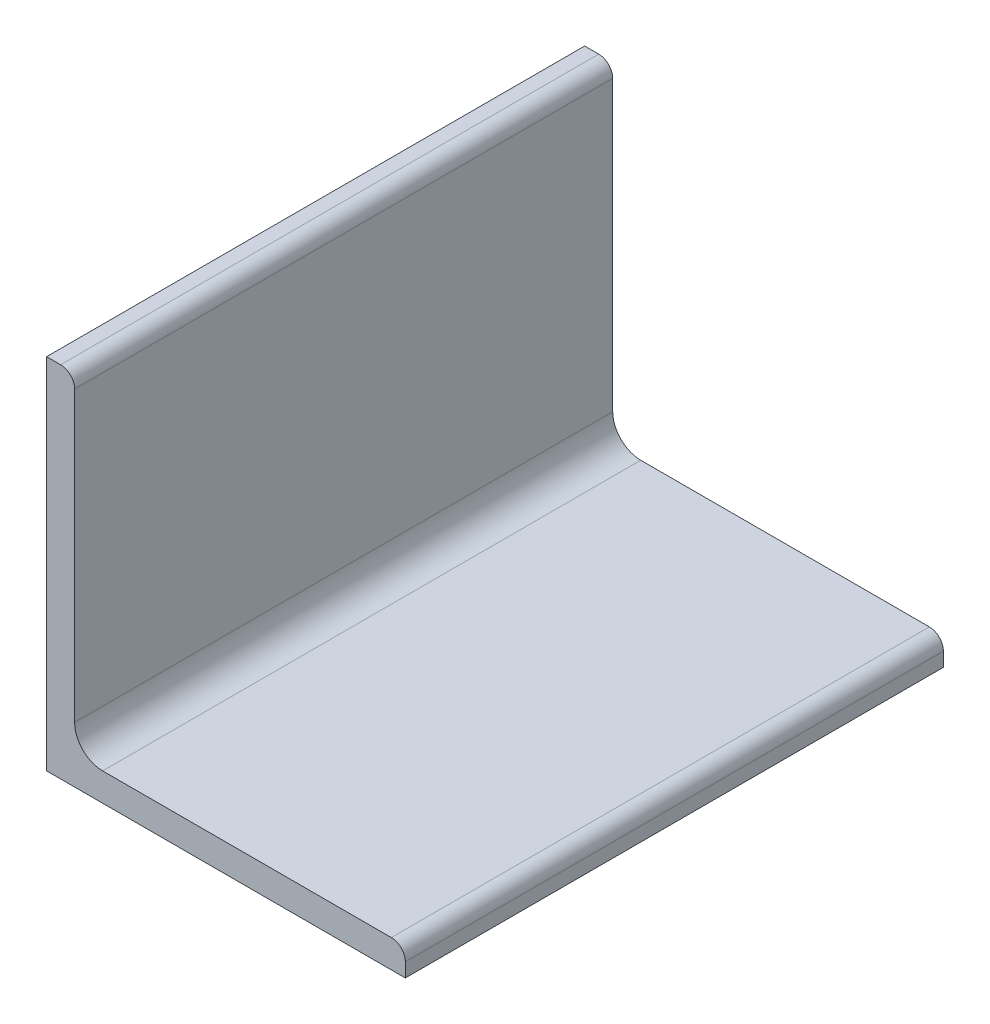
ISO-10303-21;
HEADER;
FILE_DESCRIPTION(('STEP AP214'),'2;1');
FILE_NAME('part.step','',(''),(''),'','','');
FILE_SCHEMA(('AUTOMOTIVE_DESIGN { 1 0 10303 214 1 1 1 1 }'));
ENDSEC;
DATA;
#1=APPLICATION_CONTEXT('core data for automotive mechanical design processes');
#2=APPLICATION_PROTOCOL_DEFINITION('international standard','automotive_design',2000,#1);
#3=PRODUCT_CONTEXT('',#1,'mechanical');
#4=PRODUCT('Part','Part','',(#3));
#5=PRODUCT_RELATED_PRODUCT_CATEGORY('part','',(#4));
#6=PRODUCT_DEFINITION_FORMATION('','',#4);
#7=PRODUCT_DEFINITION_CONTEXT('part definition',#1,'design');
#8=PRODUCT_DEFINITION('design','',#6,#7);
#9=PRODUCT_DEFINITION_SHAPE('','',#8);
#10=(LENGTH_UNIT() NAMED_UNIT(*) SI_UNIT(.MILLI.,.METRE.));
#11=(NAMED_UNIT(*) PLANE_ANGLE_UNIT() SI_UNIT($,.RADIAN.));
#12=(NAMED_UNIT(*) SI_UNIT($,.STERADIAN.) SOLID_ANGLE_UNIT());
#13=UNCERTAINTY_MEASURE_WITH_UNIT(LENGTH_MEASURE(1.E-05),#10,'distance_accuracy_value','');
#14=(GEOMETRIC_REPRESENTATION_CONTEXT(3) GLOBAL_UNCERTAINTY_ASSIGNED_CONTEXT((#13)) GLOBAL_UNIT_ASSIGNED_CONTEXT((#10,
#11,#12)) REPRESENTATION_CONTEXT('',''));
#15=CARTESIAN_POINT('',(0.,0.,0.));
#16=DIRECTION('',(0.,0.,1.));
#17=DIRECTION('',(1.,0.,0.));
#18=AXIS2_PLACEMENT_3D('',#15,#16,#17);
#19=CARTESIAN_POINT('',(1.17355224493876,203.678837479772,304.8));
#20=DIRECTION('',(1.,0.,0.));
#21=DIRECTION('',(0.,0.,-1.));
#22=AXIS2_PLACEMENT_3D('',#19,#20,#21);
#23=PLANE('',#22);
#24=DIRECTION('',(0.,-1.,0.));
#25=VECTOR('',#24,1.);
#26=CARTESIAN_POINT('',(1.17355224493876,203.678837479772,0.));
#27=LINE('',#26,#25);
#28=CARTESIAN_POINT('',(1.17355224493876,203.678837479772,0.));
#29=VERTEX_POINT('',#28);
#30=CARTESIAN_POINT('',(1.17355224493876,0.478837479771528,0.));
#31=VERTEX_POINT('',#30);
#32=EDGE_CURVE('E135',#29,#31,#27,.T.);
#33=ORIENTED_EDGE('',*,*,#32,.T.);
#34=DIRECTION('',(0.,0.,-1.));
#35=VECTOR('',#34,1.);
#36=CARTESIAN_POINT('',(1.17355224493876,0.478837479771528,304.8));
#37=LINE('',#36,#35);
#38=CARTESIAN_POINT('',(1.17355224493876,0.478837479771528,304.8));
#39=VERTEX_POINT('',#38);
#40=EDGE_CURVE('E11',#39,#31,#37,.T.);
#41=ORIENTED_EDGE('',*,*,#40,.F.);
#42=DIRECTION('',(0.,-1.,0.));
#43=VECTOR('',#42,1.);
#44=CARTESIAN_POINT('',(1.17355224493876,203.678837479772,304.8));
#45=LINE('',#44,#43);
#46=CARTESIAN_POINT('',(1.17355224493876,203.678837479772,304.8));
#47=VERTEX_POINT('',#46);
#48=EDGE_CURVE('E151',#47,#39,#45,.T.);
#49=ORIENTED_EDGE('',*,*,#48,.F.);
#50=DIRECTION('',(0.,0.,-1.));
#51=VECTOR('',#50,1.);
#52=CARTESIAN_POINT('',(1.17355224493876,203.678837479772,304.8));
#53=LINE('',#52,#51);
#54=EDGE_CURVE('E131',#47,#29,#53,.T.);
#55=ORIENTED_EDGE('',*,*,#54,.T.);
#56=EDGE_LOOP('',(#33,#41,#49,#55));
#57=FACE_BOUND('',#56,.T.);
#58=ADVANCED_FACE('F33',(#57),#23,.F.);
#59=CARTESIAN_POINT('',(1.17355224493876,0.478837479771528,304.8));
#60=DIRECTION('',(0.,1.,0.));
#61=DIRECTION('',(0.,0.,1.));
#62=AXIS2_PLACEMENT_3D('',#59,#60,#61);
#63=PLANE('',#62);
#64=DIRECTION('',(1.,0.,0.));
#65=VECTOR('',#64,1.);
#66=CARTESIAN_POINT('',(1.17355224493876,0.478837479771528,0.));
#67=LINE('',#66,#65);
#68=CARTESIAN_POINT('',(204.373552244939,0.478837479771528,0.));
#69=VERTEX_POINT('',#68);
#70=EDGE_CURVE('E138',#31,#69,#67,.T.);
#71=ORIENTED_EDGE('',*,*,#70,.T.);
#72=DIRECTION('',(0.,0.,-1.));
#73=VECTOR('',#72,1.);
#74=CARTESIAN_POINT('',(204.373552244939,0.478837479771528,304.8));
#75=LINE('',#74,#73);
#76=CARTESIAN_POINT('',(204.373552244939,0.478837479771528,304.8));
#77=VERTEX_POINT('',#76);
#78=EDGE_CURVE('E41',#77,#69,#75,.T.);
#79=ORIENTED_EDGE('',*,*,#78,.F.);
#80=DIRECTION('',(1.,0.,0.));
#81=VECTOR('',#80,1.);
#82=CARTESIAN_POINT('',(1.17355224493876,0.478837479771528,304.8));
#83=LINE('',#82,#81);
#84=EDGE_CURVE('E95',#39,#77,#83,.T.);
#85=ORIENTED_EDGE('',*,*,#84,.F.);
#86=ORIENTED_EDGE('',*,*,#40,.T.);
#87=EDGE_LOOP('',(#71,#79,#85,#86));
#88=FACE_BOUND('',#87,.T.);
#89=ADVANCED_FACE('F194',(#88),#63,.F.);
#90=CARTESIAN_POINT('',(204.373552244939,0.478837479771528,304.8));
#91=DIRECTION('',(-1.,0.,0.));
#92=DIRECTION('',(0.,0.,1.));
#93=AXIS2_PLACEMENT_3D('',#90,#91,#92);
#94=PLANE('',#93);
#95=DIRECTION('',(0.,1.,0.));
#96=VECTOR('',#95,1.);
#97=CARTESIAN_POINT('',(204.373552244939,0.478837479771528,0.));
#98=LINE('',#97,#96);
#99=CARTESIAN_POINT('',(204.373552244939,8.41633747977153,0.));
#100=VERTEX_POINT('',#99);
#101=EDGE_CURVE('E140',#69,#100,#98,.T.);
#102=ORIENTED_EDGE('',*,*,#101,.T.);
#103=DIRECTION('',(0.,0.,-1.));
#104=VECTOR('',#103,1.);
#105=CARTESIAN_POINT('',(204.373552244939,8.41633747977153,304.8));
#106=LINE('',#105,#104);
#107=CARTESIAN_POINT('',(204.373552244939,8.41633747977153,304.8));
#108=VERTEX_POINT('',#107);
#109=EDGE_CURVE('E161',#108,#100,#106,.T.);
#110=ORIENTED_EDGE('',*,*,#109,.F.);
#111=DIRECTION('',(0.,1.,0.));
#112=VECTOR('',#111,1.);
#113=CARTESIAN_POINT('',(204.373552244939,0.478837479771528,304.8));
#114=LINE('',#113,#112);
#115=EDGE_CURVE('E169',#77,#108,#114,.T.);
#116=ORIENTED_EDGE('',*,*,#115,.F.);
#117=ORIENTED_EDGE('',*,*,#78,.T.);
#118=EDGE_LOOP('',(#102,#110,#116,#117));
#119=FACE_BOUND('',#118,.T.);
#120=ADVANCED_FACE('F167',(#119),#94,.F.);
#121=CARTESIAN_POINT('',(196.436052244939,8.41633747977154,304.8));
#122=DIRECTION('',(0.,0.,-1.));
#123=DIRECTION('',(-1.,0.,0.));
#124=AXIS2_PLACEMENT_3D('',#121,#122,#123);
#125=CYLINDRICAL_SURFACE('',#124,7.9375);
#126=CARTESIAN_POINT('',(196.436052244939,8.41633747977154,0.));
#127=DIRECTION('',(0.,0.,1.));
#128=DIRECTION('',(1.,0.,0.));
#129=AXIS2_PLACEMENT_3D('',#126,#127,#128);
#130=CIRCLE('',#129,7.9375);
#131=CARTESIAN_POINT('',(196.436052244939,16.3538374797715,0.));
#132=VERTEX_POINT('',#131);
#133=EDGE_CURVE('E142',#100,#132,#130,.T.);
#134=ORIENTED_EDGE('',*,*,#133,.T.);
#135=DIRECTION('',(0.,0.,-1.));
#136=VECTOR('',#135,1.);
#137=CARTESIAN_POINT('',(196.436052244939,16.3538374797715,304.8));
#138=LINE('',#137,#136);
#139=CARTESIAN_POINT('',(196.436052244939,16.3538374797715,304.8));
#140=VERTEX_POINT('',#139);
#141=EDGE_CURVE('E158',#140,#132,#138,.T.);
#142=ORIENTED_EDGE('',*,*,#141,.F.);
#143=CARTESIAN_POINT('',(196.436052244939,8.41633747977154,304.8));
#144=DIRECTION('',(0.,0.,1.));
#145=DIRECTION('',(1.,0.,0.));
#146=AXIS2_PLACEMENT_3D('',#143,#144,#145);
#147=CIRCLE('',#146,7.9375);
#148=EDGE_CURVE('E185',#108,#140,#147,.T.);
#149=ORIENTED_EDGE('',*,*,#148,.F.);
#150=ORIENTED_EDGE('',*,*,#109,.T.);
#151=EDGE_LOOP('',(#134,#142,#149,#150));
#152=FACE_BOUND('',#151,.T.);
#153=ADVANCED_FACE('F178',(#152),#125,.T.);
#154=CARTESIAN_POINT('',(196.436052244939,16.3538374797715,304.8));
#155=DIRECTION('',(0.,-1.,0.));
#156=DIRECTION('',(1.,0.,0.));
#157=AXIS2_PLACEMENT_3D('',#154,#155,#156);
#158=PLANE('',#157);
#159=DIRECTION('',(-1.,0.,0.));
#160=VECTOR('',#159,1.);
#161=CARTESIAN_POINT('',(196.436052244939,16.3538374797715,0.));
#162=LINE('',#161,#160);
#163=CARTESIAN_POINT('',(32.9235522449388,16.3538374797716,0.));
#164=VERTEX_POINT('',#163);
#165=EDGE_CURVE('E144',#132,#164,#162,.T.);
#166=ORIENTED_EDGE('',*,*,#165,.T.);
#167=DIRECTION('',(0.,0.,-1.));
#168=VECTOR('',#167,1.);
#169=CARTESIAN_POINT('',(32.9235522449388,16.3538374797716,304.8));
#170=LINE('',#169,#168);
#171=CARTESIAN_POINT('',(32.9235522449388,16.3538374797716,304.8));
#172=VERTEX_POINT('',#171);
#173=EDGE_CURVE('E155',#172,#164,#170,.T.);
#174=ORIENTED_EDGE('',*,*,#173,.F.);
#175=DIRECTION('',(-1.,0.,0.));
#176=VECTOR('',#175,1.);
#177=CARTESIAN_POINT('',(196.436052244939,16.3538374797715,304.8));
#178=LINE('',#177,#176);
#179=EDGE_CURVE('E184',#140,#172,#178,.T.);
#180=ORIENTED_EDGE('',*,*,#179,.F.);
#181=ORIENTED_EDGE('',*,*,#141,.T.);
#182=EDGE_LOOP('',(#166,#174,#180,#181));
#183=FACE_BOUND('',#182,.T.);
#184=ADVANCED_FACE('F182',(#183),#158,.F.);
#185=CARTESIAN_POINT('',(32.9235522449387,32.2288374797715,304.8));
#186=DIRECTION('',(0.,0.,-1.));
#187=DIRECTION('',(-1.,0.,0.));
#188=AXIS2_PLACEMENT_3D('',#185,#186,#187);
#189=CYLINDRICAL_SURFACE('',#188,15.875);
#190=CARTESIAN_POINT('',(32.9235522449387,32.2288374797715,0.));
#191=DIRECTION('',(0.,0.,-1.));
#192=DIRECTION('',(1.,0.,0.));
#193=AXIS2_PLACEMENT_3D('',#190,#191,#192);
#194=CIRCLE('',#193,15.875);
#195=CARTESIAN_POINT('',(17.0485522449388,32.2288374797715,0.));
#196=VERTEX_POINT('',#195);
#197=EDGE_CURVE('E146',#164,#196,#194,.T.);
#198=ORIENTED_EDGE('',*,*,#197,.T.);
#199=DIRECTION('',(0.,0.,-1.));
#200=VECTOR('',#199,1.);
#201=CARTESIAN_POINT('',(17.0485522449388,32.2288374797715,304.8));
#202=LINE('',#201,#200);
#203=CARTESIAN_POINT('',(17.0485522449388,32.2288374797715,304.8));
#204=VERTEX_POINT('',#203);
#205=EDGE_CURVE('E126',#204,#196,#202,.T.);
#206=ORIENTED_EDGE('',*,*,#205,.F.);
#207=CARTESIAN_POINT('',(32.9235522449387,32.2288374797715,304.8));
#208=DIRECTION('',(0.,0.,-1.));
#209=DIRECTION('',(1.,0.,0.));
#210=AXIS2_PLACEMENT_3D('',#207,#208,#209);
#211=CIRCLE('',#210,15.875);
#212=EDGE_CURVE('E117',#172,#204,#211,.T.);
#213=ORIENTED_EDGE('',*,*,#212,.F.);
#214=ORIENTED_EDGE('',*,*,#173,.T.);
#215=EDGE_LOOP('',(#198,#206,#213,#214));
#216=FACE_BOUND('',#215,.T.);
#217=ADVANCED_FACE('F206',(#216),#189,.F.);
#218=CARTESIAN_POINT('',(17.0485522449388,32.2288374797715,304.8));
#219=DIRECTION('',(-1.,0.,0.));
#220=DIRECTION('',(0.,0.,1.));
#221=AXIS2_PLACEMENT_3D('',#218,#219,#220);
#222=PLANE('',#221);
#223=DIRECTION('',(0.,1.,0.));
#224=VECTOR('',#223,1.);
#225=CARTESIAN_POINT('',(17.0485522449388,32.2288374797715,0.));
#226=LINE('',#225,#224);
#227=CARTESIAN_POINT('',(17.0485522449388,195.741337479772,0.));
#228=VERTEX_POINT('',#227);
#229=EDGE_CURVE('E125',#196,#228,#226,.T.);
#230=ORIENTED_EDGE('',*,*,#229,.T.);
#231=DIRECTION('',(0.,0.,-1.));
#232=VECTOR('',#231,1.);
#233=CARTESIAN_POINT('',(17.0485522449388,195.741337479772,304.8));
#234=LINE('',#233,#232);
#235=CARTESIAN_POINT('',(17.0485522449388,195.741337479772,304.8));
#236=VERTEX_POINT('',#235);
#237=EDGE_CURVE('E122',#236,#228,#234,.T.);
#238=ORIENTED_EDGE('',*,*,#237,.F.);
#239=DIRECTION('',(0.,1.,0.));
#240=VECTOR('',#239,1.);
#241=CARTESIAN_POINT('',(17.0485522449388,32.2288374797715,304.8));
#242=LINE('',#241,#240);
#243=EDGE_CURVE('E111',#204,#236,#242,.T.);
#244=ORIENTED_EDGE('',*,*,#243,.F.);
#245=ORIENTED_EDGE('',*,*,#205,.T.);
#246=EDGE_LOOP('',(#230,#238,#244,#245));
#247=FACE_BOUND('',#246,.T.);
#248=ADVANCED_FACE('F123',(#247),#222,.F.);
#249=CARTESIAN_POINT('',(9.11105224493876,195.741337479772,304.8));
#250=DIRECTION('',(0.,0.,-1.));
#251=DIRECTION('',(-1.,0.,0.));
#252=AXIS2_PLACEMENT_3D('',#249,#250,#251);
#253=CYLINDRICAL_SURFACE('',#252,7.93749999999999);
#254=CARTESIAN_POINT('',(9.11105224493876,195.741337479772,0.));
#255=DIRECTION('',(0.,0.,1.));
#256=DIRECTION('',(1.,0.,0.));
#257=AXIS2_PLACEMENT_3D('',#254,#255,#256);
#258=CIRCLE('',#257,7.93749999999999);
#259=CARTESIAN_POINT('',(9.11105224493876,203.678837479772,0.));
#260=VERTEX_POINT('',#259);
#261=EDGE_CURVE('E81',#228,#260,#258,.T.);
#262=ORIENTED_EDGE('',*,*,#261,.T.);
#263=DIRECTION('',(0.,0.,-1.));
#264=VECTOR('',#263,1.);
#265=CARTESIAN_POINT('',(9.11105224493876,203.678837479772,304.8));
#266=LINE('',#265,#264);
#267=CARTESIAN_POINT('',(9.11105224493876,203.678837479772,304.8));
#268=VERTEX_POINT('',#267);
#269=EDGE_CURVE('E127',#268,#260,#266,.T.);
#270=ORIENTED_EDGE('',*,*,#269,.F.);
#271=CARTESIAN_POINT('',(9.11105224493876,195.741337479772,304.8));
#272=DIRECTION('',(0.,0.,1.));
#273=DIRECTION('',(1.,0.,0.));
#274=AXIS2_PLACEMENT_3D('',#271,#272,#273);
#275=CIRCLE('',#274,7.93749999999999);
#276=EDGE_CURVE('E115',#236,#268,#275,.T.);
#277=ORIENTED_EDGE('',*,*,#276,.F.);
#278=ORIENTED_EDGE('',*,*,#237,.T.);
#279=EDGE_LOOP('',(#262,#270,#277,#278));
#280=FACE_BOUND('',#279,.T.);
#281=ADVANCED_FACE('F129',(#280),#253,.T.);
#282=CARTESIAN_POINT('',(9.11105224493876,203.678837479772,304.8));
#283=DIRECTION('',(0.,-1.,0.));
#284=DIRECTION('',(0.,0.,-1.));
#285=AXIS2_PLACEMENT_3D('',#282,#283,#284);
#286=PLANE('',#285);
#287=DIRECTION('',(-1.,0.,0.));
#288=VECTOR('',#287,1.);
#289=CARTESIAN_POINT('',(9.11105224493876,203.678837479772,0.));
#290=LINE('',#289,#288);
#291=EDGE_CURVE('E87',#260,#29,#290,.T.);
#292=ORIENTED_EDGE('',*,*,#291,.T.);
#293=ORIENTED_EDGE('',*,*,#54,.F.);
#294=DIRECTION('',(-1.,0.,0.));
#295=VECTOR('',#294,1.);
#296=CARTESIAN_POINT('',(9.11105224493876,203.678837479772,304.8));
#297=LINE('',#296,#295);
#298=EDGE_CURVE('E49',#268,#47,#297,.T.);
#299=ORIENTED_EDGE('',*,*,#298,.F.);
#300=ORIENTED_EDGE('',*,*,#269,.T.);
#301=EDGE_LOOP('',(#292,#293,#299,#300));
#302=FACE_BOUND('',#301,.T.);
#303=ADVANCED_FACE('F214',(#302),#286,.F.);
#304=CARTESIAN_POINT('',(196.436052244939,8.41633747977154,304.8));
#305=DIRECTION('',(0.,0.,1.));
#306=DIRECTION('',(1.,0.,0.));
#307=AXIS2_PLACEMENT_3D('',#304,#305,#306);
#308=PLANE('',#307);
#309=ORIENTED_EDGE('',*,*,#48,.T.);
#310=ORIENTED_EDGE('',*,*,#84,.T.);
#311=ORIENTED_EDGE('',*,*,#115,.T.);
#312=ORIENTED_EDGE('',*,*,#148,.T.);
#313=ORIENTED_EDGE('',*,*,#179,.T.);
#314=ORIENTED_EDGE('',*,*,#212,.T.);
#315=ORIENTED_EDGE('',*,*,#243,.T.);
#316=ORIENTED_EDGE('',*,*,#276,.T.);
#317=ORIENTED_EDGE('',*,*,#298,.T.);
#318=EDGE_LOOP('',(#309,#310,#311,#312,#313,#314,#315,#316,#317));
#319=FACE_BOUND('',#318,.T.);
#320=ADVANCED_FACE('F113',(#319),#308,.T.);
#321=CARTESIAN_POINT('',(196.436052244939,8.41633747977154,0.));
#322=DIRECTION('',(0.,0.,1.));
#323=DIRECTION('',(1.,0.,0.));
#324=AXIS2_PLACEMENT_3D('',#321,#322,#323);
#325=PLANE('',#324);
#326=ORIENTED_EDGE('',*,*,#32,.F.);
#327=ORIENTED_EDGE('',*,*,#291,.F.);
#328=ORIENTED_EDGE('',*,*,#261,.F.);
#329=ORIENTED_EDGE('',*,*,#229,.F.);
#330=ORIENTED_EDGE('',*,*,#197,.F.);
#331=ORIENTED_EDGE('',*,*,#165,.F.);
#332=ORIENTED_EDGE('',*,*,#133,.F.);
#333=ORIENTED_EDGE('',*,*,#101,.F.);
#334=ORIENTED_EDGE('',*,*,#70,.F.);
#335=EDGE_LOOP('',(#326,#327,#328,#329,#330,#331,#332,#333,#334));
#336=FACE_BOUND('',#335,.T.);
#337=ADVANCED_FACE('F173',(#336),#325,.F.);
#338=CLOSED_SHELL('',(#58,#89,#120,#153,#184,#217,#248,#281,#303,#320,#337));
#339=MANIFOLD_SOLID_BREP('B2',#338);
#340=ADVANCED_BREP_SHAPE_REPRESENTATION('',(#18,#339),#14);
#341=SHAPE_DEFINITION_REPRESENTATION(#9,#340);
ENDSEC;
END-ISO-10303-21;
